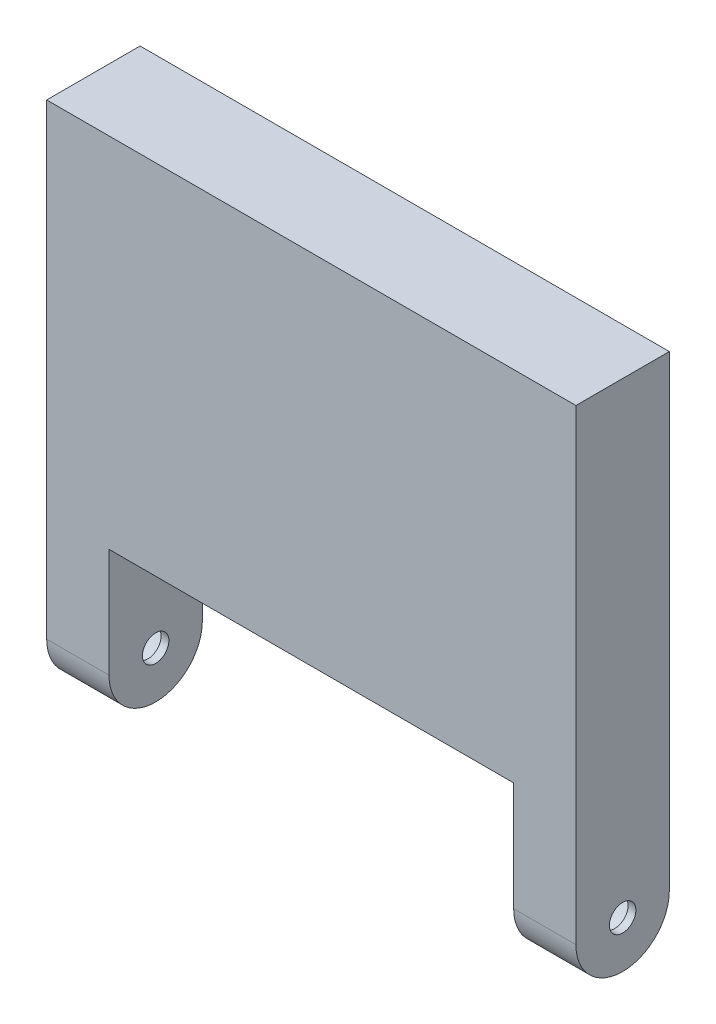
ISO-10303-21;
HEADER;
FILE_DESCRIPTION(('STEP AP214'),'2;1');
FILE_NAME('part.step','',(''),(''),'','','');
FILE_SCHEMA(('AUTOMOTIVE_DESIGN { 1 0 10303 214 1 1 1 1 }'));
ENDSEC;
DATA;
#1=APPLICATION_CONTEXT('core data for automotive mechanical design processes');
#2=APPLICATION_PROTOCOL_DEFINITION('international standard','automotive_design',2000,#1);
#3=PRODUCT_CONTEXT('',#1,'mechanical');
#4=PRODUCT('Part','Part','',(#3));
#5=PRODUCT_RELATED_PRODUCT_CATEGORY('part','',(#4));
#6=PRODUCT_DEFINITION_FORMATION('','',#4);
#7=PRODUCT_DEFINITION_CONTEXT('part definition',#1,'design');
#8=PRODUCT_DEFINITION('design','',#6,#7);
#9=PRODUCT_DEFINITION_SHAPE('','',#8);
#10=(LENGTH_UNIT() NAMED_UNIT(*) SI_UNIT(.MILLI.,.METRE.));
#11=(NAMED_UNIT(*) PLANE_ANGLE_UNIT() SI_UNIT($,.RADIAN.));
#12=(NAMED_UNIT(*) SI_UNIT($,.STERADIAN.) SOLID_ANGLE_UNIT());
#13=UNCERTAINTY_MEASURE_WITH_UNIT(LENGTH_MEASURE(1.E-05),#10,'distance_accuracy_value','');
#14=(GEOMETRIC_REPRESENTATION_CONTEXT(3) GLOBAL_UNCERTAINTY_ASSIGNED_CONTEXT((#13)) GLOBAL_UNIT_ASSIGNED_CONTEXT((#10,
#11,#12)) REPRESENTATION_CONTEXT('',''));
#15=CARTESIAN_POINT('',(0.,0.,0.));
#16=DIRECTION('',(0.,0.,1.));
#17=DIRECTION('',(1.,0.,0.));
#18=AXIS2_PLACEMENT_3D('',#15,#16,#17);
#19=CARTESIAN_POINT('',(-130.,0.,0.));
#20=DIRECTION('',(1.,0.,0.));
#21=DIRECTION('',(0.,0.,-1.));
#22=AXIS2_PLACEMENT_3D('',#19,#20,#21);
#23=PLANE('',#22);
#24=CARTESIAN_POINT('',(-130.,0.,0.));
#25=DIRECTION('',(1.,0.,0.));
#26=DIRECTION('',(0.,0.,-1.));
#27=AXIS2_PLACEMENT_3D('',#24,#25,#26);
#28=CIRCLE('',#27,8.5);
#29=CARTESIAN_POINT('',(-130.,0.,-8.5));
#30=VERTEX_POINT('',#29);
#31=EDGE_CURVE('E231',#30,#30,#28,.T.);
#32=ORIENTED_EDGE('',*,*,#31,.F.);
#33=EDGE_LOOP('',(#32));
#34=FACE_BOUND('',#33,.T.);
#35=DIRECTION('',(0.,-1.,0.));
#36=VECTOR('',#35,1.);
#37=CARTESIAN_POINT('',(-130.,0.,-30.));
#38=LINE('',#37,#36);
#39=CARTESIAN_POINT('',(-130.,70.,-30.));
#40=VERTEX_POINT('',#39);
#41=CARTESIAN_POINT('',(-130.,0.,-30.));
#42=VERTEX_POINT('',#41);
#43=EDGE_CURVE('E240',#40,#42,#38,.T.);
#44=ORIENTED_EDGE('',*,*,#43,.F.);
#45=DIRECTION('',(0.,0.,1.));
#46=VECTOR('',#45,1.);
#47=CARTESIAN_POINT('',(-130.,70.,0.));
#48=LINE('',#47,#46);
#49=CARTESIAN_POINT('',(-130.,70.,30.));
#50=VERTEX_POINT('',#49);
#51=EDGE_CURVE('E153',#40,#50,#48,.T.);
#52=ORIENTED_EDGE('',*,*,#51,.T.);
#53=DIRECTION('',(0.,1.,0.));
#54=VECTOR('',#53,1.);
#55=CARTESIAN_POINT('',(-130.,0.,30.));
#56=LINE('',#55,#54);
#57=CARTESIAN_POINT('',(-130.,0.,30.));
#58=VERTEX_POINT('',#57);
#59=EDGE_CURVE('E242',#58,#50,#56,.T.);
#60=ORIENTED_EDGE('',*,*,#59,.F.);
#61=CARTESIAN_POINT('',(-130.,0.,0.));
#62=DIRECTION('',(1.,0.,0.));
#63=DIRECTION('',(0.,0.,-1.));
#64=AXIS2_PLACEMENT_3D('',#61,#62,#63);
#65=CIRCLE('',#64,30.);
#66=EDGE_CURVE('E237',#58,#42,#65,.T.);
#67=ORIENTED_EDGE('',*,*,#66,.T.);
#68=EDGE_LOOP('',(#44,#52,#60,#67));
#69=FACE_BOUND('',#68,.T.);
#70=ADVANCED_FACE('F35',(#34,#69),#23,.T.);
#71=CARTESIAN_POINT('',(-165.,0.,0.));
#72=DIRECTION('',(-1.,0.,0.));
#73=DIRECTION('',(0.,0.,1.));
#74=AXIS2_PLACEMENT_3D('',#71,#72,#73);
#75=CYLINDRICAL_SURFACE('',#74,30.);
#76=CARTESIAN_POINT('',(-170.,0.,0.));
#77=DIRECTION('',(1.,0.,0.));
#78=DIRECTION('',(0.,0.,-1.));
#79=AXIS2_PLACEMENT_3D('',#76,#77,#78);
#80=CIRCLE('',#79,30.);
#81=CARTESIAN_POINT('',(-170.,0.,30.));
#82=VERTEX_POINT('',#81);
#83=CARTESIAN_POINT('',(-170.,0.,-30.));
#84=VERTEX_POINT('',#83);
#85=EDGE_CURVE('E279',#82,#84,#80,.T.);
#86=ORIENTED_EDGE('',*,*,#85,.T.);
#87=DIRECTION('',(-1.,0.,0.));
#88=VECTOR('',#87,1.);
#89=CARTESIAN_POINT('',(-165.,0.,-30.));
#90=LINE('',#89,#88);
#91=EDGE_CURVE('E11',#42,#84,#90,.T.);
#92=ORIENTED_EDGE('',*,*,#91,.F.);
#93=ORIENTED_EDGE('',*,*,#66,.F.);
#94=DIRECTION('',(-1.,0.,0.));
#95=VECTOR('',#94,1.);
#96=CARTESIAN_POINT('',(-165.,0.,30.));
#97=LINE('',#96,#95);
#98=EDGE_CURVE('E291',#58,#82,#97,.T.);
#99=ORIENTED_EDGE('',*,*,#98,.T.);
#100=EDGE_LOOP('',(#86,#92,#93,#99));
#101=FACE_BOUND('',#100,.T.);
#102=ADVANCED_FACE('F37',(#101),#75,.T.);
#103=CARTESIAN_POINT('',(-165.,0.,-30.));
#104=DIRECTION('',(0.,0.,-1.));
#105=DIRECTION('',(-1.,0.,0.));
#106=AXIS2_PLACEMENT_3D('',#103,#104,#105);
#107=PLANE('',#106);
#108=DIRECTION('',(0.,-1.,0.));
#109=VECTOR('',#108,1.);
#110=CARTESIAN_POINT('',(-170.,0.,-30.));
#111=LINE('',#110,#109);
#112=CARTESIAN_POINT('',(-170.,300.,-30.));
#113=VERTEX_POINT('',#112);
#114=EDGE_CURVE('E282',#113,#84,#111,.T.);
#115=ORIENTED_EDGE('',*,*,#114,.F.);
#116=DIRECTION('',(-1.,0.,0.));
#117=VECTOR('',#116,1.);
#118=CARTESIAN_POINT('',(-165.,300.,-30.));
#119=LINE('',#118,#117);
#120=CARTESIAN_POINT('',(170.,300.,-30.));
#121=VERTEX_POINT('',#120);
#122=EDGE_CURVE('E44',#121,#113,#119,.T.);
#123=ORIENTED_EDGE('',*,*,#122,.F.);
#124=DIRECTION('',(0.,-1.,0.));
#125=VECTOR('',#124,1.);
#126=CARTESIAN_POINT('',(170.,0.,-30.));
#127=LINE('',#126,#125);
#128=CARTESIAN_POINT('',(170.,0.,-30.));
#129=VERTEX_POINT('',#128);
#130=EDGE_CURVE('E208',#121,#129,#127,.T.);
#131=ORIENTED_EDGE('',*,*,#130,.T.);
#132=DIRECTION('',(1.,0.,0.));
#133=VECTOR('',#132,1.);
#134=CARTESIAN_POINT('',(165.,0.,-30.));
#135=LINE('',#134,#133);
#136=CARTESIAN_POINT('',(130.,0.,-30.));
#137=VERTEX_POINT('',#136);
#138=EDGE_CURVE('E171',#137,#129,#135,.T.);
#139=ORIENTED_EDGE('',*,*,#138,.F.);
#140=DIRECTION('',(0.,-1.,0.));
#141=VECTOR('',#140,1.);
#142=CARTESIAN_POINT('',(130.,0.,-30.));
#143=LINE('',#142,#141);
#144=CARTESIAN_POINT('',(130.,70.,-30.));
#145=VERTEX_POINT('',#144);
#146=EDGE_CURVE('E162',#145,#137,#143,.T.);
#147=ORIENTED_EDGE('',*,*,#146,.F.);
#148=DIRECTION('',(-1.,0.,0.));
#149=VECTOR('',#148,1.);
#150=CARTESIAN_POINT('',(237.697286480094,70.,-30.));
#151=LINE('',#150,#149);
#152=EDGE_CURVE('E148',#145,#40,#151,.T.);
#153=ORIENTED_EDGE('',*,*,#152,.T.);
#154=ORIENTED_EDGE('',*,*,#43,.T.);
#155=ORIENTED_EDGE('',*,*,#91,.T.);
#156=EDGE_LOOP('',(#115,#123,#131,#139,#147,#153,#154,#155));
#157=FACE_BOUND('',#156,.T.);
#158=ADVANCED_FACE('F169',(#157),#107,.T.);
#159=CARTESIAN_POINT('',(-165.,300.,0.));
#160=DIRECTION('',(0.,1.,0.));
#161=DIRECTION('',(0.,0.,1.));
#162=AXIS2_PLACEMENT_3D('',#159,#160,#161);
#163=PLANE('',#162);
#164=DIRECTION('',(0.,0.,-1.));
#165=VECTOR('',#164,1.);
#166=CARTESIAN_POINT('',(-170.,300.,0.));
#167=LINE('',#166,#165);
#168=CARTESIAN_POINT('',(-170.,300.,30.));
#169=VERTEX_POINT('',#168);
#170=EDGE_CURVE('E285',#169,#113,#167,.T.);
#171=ORIENTED_EDGE('',*,*,#170,.F.);
#172=DIRECTION('',(-1.,0.,0.));
#173=VECTOR('',#172,1.);
#174=CARTESIAN_POINT('',(-165.,300.,30.));
#175=LINE('',#174,#173);
#176=CARTESIAN_POINT('',(170.,300.,30.));
#177=VERTEX_POINT('',#176);
#178=EDGE_CURVE('E293',#177,#169,#175,.T.);
#179=ORIENTED_EDGE('',*,*,#178,.F.);
#180=DIRECTION('',(0.,0.,-1.));
#181=VECTOR('',#180,1.);
#182=CARTESIAN_POINT('',(170.,300.,0.));
#183=LINE('',#182,#181);
#184=EDGE_CURVE('E210',#177,#121,#183,.T.);
#185=ORIENTED_EDGE('',*,*,#184,.T.);
#186=ORIENTED_EDGE('',*,*,#122,.T.);
#187=EDGE_LOOP('',(#171,#179,#185,#186));
#188=FACE_BOUND('',#187,.T.);
#189=ADVANCED_FACE('F297',(#188),#163,.T.);
#190=CARTESIAN_POINT('',(-165.,0.,30.));
#191=DIRECTION('',(0.,0.,1.));
#192=DIRECTION('',(1.,0.,0.));
#193=AXIS2_PLACEMENT_3D('',#190,#191,#192);
#194=PLANE('',#193);
#195=DIRECTION('',(0.,1.,0.));
#196=VECTOR('',#195,1.);
#197=CARTESIAN_POINT('',(-170.,0.,30.));
#198=LINE('',#197,#196);
#199=EDGE_CURVE('E288',#82,#169,#198,.T.);
#200=ORIENTED_EDGE('',*,*,#199,.F.);
#201=ORIENTED_EDGE('',*,*,#98,.F.);
#202=ORIENTED_EDGE('',*,*,#59,.T.);
#203=DIRECTION('',(-1.,0.,0.));
#204=VECTOR('',#203,1.);
#205=CARTESIAN_POINT('',(237.697286480094,70.,30.));
#206=LINE('',#205,#204);
#207=CARTESIAN_POINT('',(130.,70.,30.));
#208=VERTEX_POINT('',#207);
#209=EDGE_CURVE('E51',#208,#50,#206,.T.);
#210=ORIENTED_EDGE('',*,*,#209,.F.);
#211=DIRECTION('',(0.,1.,0.));
#212=VECTOR('',#211,1.);
#213=CARTESIAN_POINT('',(130.,0.,30.));
#214=LINE('',#213,#212);
#215=CARTESIAN_POINT('',(130.,0.,30.));
#216=VERTEX_POINT('',#215);
#217=EDGE_CURVE('E164',#216,#208,#214,.T.);
#218=ORIENTED_EDGE('',*,*,#217,.F.);
#219=DIRECTION('',(1.,0.,0.));
#220=VECTOR('',#219,1.);
#221=CARTESIAN_POINT('',(165.,0.,30.));
#222=LINE('',#221,#220);
#223=CARTESIAN_POINT('',(170.,0.,30.));
#224=VERTEX_POINT('',#223);
#225=EDGE_CURVE('E216',#216,#224,#222,.T.);
#226=ORIENTED_EDGE('',*,*,#225,.T.);
#227=DIRECTION('',(0.,1.,0.));
#228=VECTOR('',#227,1.);
#229=CARTESIAN_POINT('',(170.,0.,30.));
#230=LINE('',#229,#228);
#231=EDGE_CURVE('E213',#224,#177,#230,.T.);
#232=ORIENTED_EDGE('',*,*,#231,.T.);
#233=ORIENTED_EDGE('',*,*,#178,.T.);
#234=EDGE_LOOP('',(#200,#201,#202,#210,#218,#226,#232,#233));
#235=FACE_BOUND('',#234,.T.);
#236=ADVANCED_FACE('F306',(#235),#194,.T.);
#237=CARTESIAN_POINT('',(-170.,0.,0.));
#238=DIRECTION('',(1.,0.,0.));
#239=DIRECTION('',(0.,0.,-1.));
#240=AXIS2_PLACEMENT_3D('',#237,#238,#239);
#241=PLANE('',#240);
#242=CARTESIAN_POINT('',(-170.,0.,0.));
#243=DIRECTION('',(1.,0.,0.));
#244=DIRECTION('',(0.,0.,-1.));
#245=AXIS2_PLACEMENT_3D('',#242,#243,#244);
#246=CIRCLE('',#245,8.5);
#247=CARTESIAN_POINT('',(-170.,0.,-8.5));
#248=VERTEX_POINT('',#247);
#249=EDGE_CURVE('E220',#248,#248,#246,.T.);
#250=ORIENTED_EDGE('',*,*,#249,.T.);
#251=EDGE_LOOP('',(#250));
#252=FACE_BOUND('',#251,.T.);
#253=ORIENTED_EDGE('',*,*,#85,.F.);
#254=ORIENTED_EDGE('',*,*,#199,.T.);
#255=ORIENTED_EDGE('',*,*,#170,.T.);
#256=ORIENTED_EDGE('',*,*,#114,.T.);
#257=EDGE_LOOP('',(#253,#254,#255,#256));
#258=FACE_BOUND('',#257,.T.);
#259=ADVANCED_FACE('F303',(#252,#258),#241,.F.);
#260=CARTESIAN_POINT('',(237.697286480094,70.,0.));
#261=DIRECTION('',(0.,-1.,0.));
#262=DIRECTION('',(0.,0.,-1.));
#263=AXIS2_PLACEMENT_3D('',#260,#261,#262);
#264=PLANE('',#263);
#265=ORIENTED_EDGE('',*,*,#152,.F.);
#266=DIRECTION('',(0.,0.,1.));
#267=VECTOR('',#266,1.);
#268=CARTESIAN_POINT('',(130.,70.,0.));
#269=LINE('',#268,#267);
#270=EDGE_CURVE('E151',#145,#208,#269,.T.);
#271=ORIENTED_EDGE('',*,*,#270,.T.);
#272=ORIENTED_EDGE('',*,*,#209,.T.);
#273=ORIENTED_EDGE('',*,*,#51,.F.);
#274=EDGE_LOOP('',(#265,#271,#272,#273));
#275=FACE_BOUND('',#274,.T.);
#276=ADVANCED_FACE('F150',(#275),#264,.T.);
#277=CARTESIAN_POINT('',(-135.,0.,0.));
#278=DIRECTION('',(-1.,0.,0.));
#279=DIRECTION('',(0.,0.,1.));
#280=AXIS2_PLACEMENT_3D('',#277,#278,#279);
#281=CYLINDRICAL_SURFACE('',#280,25.);
#282=CARTESIAN_POINT('',(-165.,0.,0.));
#283=DIRECTION('',(1.,0.,0.));
#284=DIRECTION('',(0.,0.,-1.));
#285=AXIS2_PLACEMENT_3D('',#282,#283,#284);
#286=CIRCLE('',#285,25.);
#287=CARTESIAN_POINT('',(-165.,0.,25.));
#288=VERTEX_POINT('',#287);
#289=CARTESIAN_POINT('',(-165.,0.,-25.));
#290=VERTEX_POINT('',#289);
#291=EDGE_CURVE('E264',#288,#290,#286,.T.);
#292=ORIENTED_EDGE('',*,*,#291,.F.);
#293=DIRECTION('',(-1.,0.,0.));
#294=VECTOR('',#293,1.);
#295=CARTESIAN_POINT('',(-135.,0.,25.));
#296=LINE('',#295,#294);
#297=CARTESIAN_POINT('',(-135.,0.,25.));
#298=VERTEX_POINT('',#297);
#299=EDGE_CURVE('E275',#298,#288,#296,.T.);
#300=ORIENTED_EDGE('',*,*,#299,.F.);
#301=CARTESIAN_POINT('',(-135.,0.,0.));
#302=DIRECTION('',(1.,0.,0.));
#303=DIRECTION('',(0.,0.,-1.));
#304=AXIS2_PLACEMENT_3D('',#301,#302,#303);
#305=CIRCLE('',#304,25.);
#306=CARTESIAN_POINT('',(-135.,0.,-25.));
#307=VERTEX_POINT('',#306);
#308=EDGE_CURVE('E256',#298,#307,#305,.T.);
#309=ORIENTED_EDGE('',*,*,#308,.T.);
#310=DIRECTION('',(-1.,0.,0.));
#311=VECTOR('',#310,1.);
#312=CARTESIAN_POINT('',(-135.,0.,-25.));
#313=LINE('',#312,#311);
#314=EDGE_CURVE('E277',#307,#290,#313,.T.);
#315=ORIENTED_EDGE('',*,*,#314,.T.);
#316=EDGE_LOOP('',(#292,#300,#309,#315));
#317=FACE_BOUND('',#316,.T.);
#318=ADVANCED_FACE('F333',(#317),#281,.F.);
#319=CARTESIAN_POINT('',(-135.,0.,0.));
#320=DIRECTION('',(1.,0.,0.));
#321=DIRECTION('',(0.,0.,-1.));
#322=AXIS2_PLACEMENT_3D('',#319,#320,#321);
#323=PLANE('',#322);
#324=CARTESIAN_POINT('',(-135.,0.,0.));
#325=DIRECTION('',(1.,0.,0.));
#326=DIRECTION('',(0.,0.,-1.));
#327=AXIS2_PLACEMENT_3D('',#324,#325,#326);
#328=CIRCLE('',#327,8.5);
#329=CARTESIAN_POINT('',(-135.,0.,-8.5));
#330=VERTEX_POINT('',#329);
#331=EDGE_CURVE('E228',#330,#330,#328,.T.);
#332=ORIENTED_EDGE('',*,*,#331,.T.);
#333=EDGE_LOOP('',(#332));
#334=FACE_BOUND('',#333,.T.);
#335=DIRECTION('',(0.,0.,1.));
#336=VECTOR('',#335,1.);
#337=CARTESIAN_POINT('',(-135.,75.,0.));
#338=LINE('',#337,#336);
#339=CARTESIAN_POINT('',(-135.,75.,-25.));
#340=VERTEX_POINT('',#339);
#341=CARTESIAN_POINT('',(-135.,75.,25.));
#342=VERTEX_POINT('',#341);
#343=EDGE_CURVE('E234',#340,#342,#338,.T.);
#344=ORIENTED_EDGE('',*,*,#343,.F.);
#345=DIRECTION('',(0.,-1.,0.));
#346=VECTOR('',#345,1.);
#347=CARTESIAN_POINT('',(-135.,0.,-25.));
#348=LINE('',#347,#346);
#349=EDGE_CURVE('E253',#340,#307,#348,.T.);
#350=ORIENTED_EDGE('',*,*,#349,.T.);
#351=ORIENTED_EDGE('',*,*,#308,.F.);
#352=DIRECTION('',(0.,1.,0.));
#353=VECTOR('',#352,1.);
#354=CARTESIAN_POINT('',(-135.,0.,25.));
#355=LINE('',#354,#353);
#356=EDGE_CURVE('E59',#298,#342,#355,.T.);
#357=ORIENTED_EDGE('',*,*,#356,.T.);
#358=EDGE_LOOP('',(#344,#350,#351,#357));
#359=FACE_BOUND('',#358,.T.);
#360=ADVANCED_FACE('F329',(#334,#359),#323,.F.);
#361=CARTESIAN_POINT('',(-165.,0.,0.));
#362=DIRECTION('',(1.,0.,0.));
#363=DIRECTION('',(0.,0.,-1.));
#364=AXIS2_PLACEMENT_3D('',#361,#362,#363);
#365=PLANE('',#364);
#366=CARTESIAN_POINT('',(-165.,0.,0.));
#367=DIRECTION('',(1.,0.,0.));
#368=DIRECTION('',(0.,0.,-1.));
#369=AXIS2_PLACEMENT_3D('',#366,#367,#368);
#370=CIRCLE('',#369,8.5);
#371=CARTESIAN_POINT('',(-165.,0.,-8.5));
#372=VERTEX_POINT('',#371);
#373=EDGE_CURVE('E39',#372,#372,#370,.T.);
#374=ORIENTED_EDGE('',*,*,#373,.F.);
#375=EDGE_LOOP('',(#374));
#376=FACE_BOUND('',#375,.T.);
#377=ORIENTED_EDGE('',*,*,#291,.T.);
#378=DIRECTION('',(0.,-1.,0.));
#379=VECTOR('',#378,1.);
#380=CARTESIAN_POINT('',(-165.,0.,-25.));
#381=LINE('',#380,#379);
#382=CARTESIAN_POINT('',(-165.,295.,-25.));
#383=VERTEX_POINT('',#382);
#384=EDGE_CURVE('E252',#383,#290,#381,.T.);
#385=ORIENTED_EDGE('',*,*,#384,.F.);
#386=DIRECTION('',(0.,0.,-1.));
#387=VECTOR('',#386,1.);
#388=CARTESIAN_POINT('',(-165.,295.,0.));
#389=LINE('',#388,#387);
#390=CARTESIAN_POINT('',(-165.,295.,25.));
#391=VERTEX_POINT('',#390);
#392=EDGE_CURVE('E257',#391,#383,#389,.T.);
#393=ORIENTED_EDGE('',*,*,#392,.F.);
#394=DIRECTION('',(0.,1.,0.));
#395=VECTOR('',#394,1.);
#396=CARTESIAN_POINT('',(-165.,0.,25.));
#397=LINE('',#396,#395);
#398=EDGE_CURVE('E267',#288,#391,#397,.T.);
#399=ORIENTED_EDGE('',*,*,#398,.F.);
#400=EDGE_LOOP('',(#377,#385,#393,#399));
#401=FACE_BOUND('',#400,.T.);
#402=ADVANCED_FACE('F332',(#376,#401),#365,.T.);
#403=CARTESIAN_POINT('',(-135.,295.,0.));
#404=DIRECTION('',(0.,1.,0.));
#405=DIRECTION('',(0.,0.,1.));
#406=AXIS2_PLACEMENT_3D('',#403,#404,#405);
#407=PLANE('',#406);
#408=ORIENTED_EDGE('',*,*,#392,.T.);
#409=DIRECTION('',(-1.,0.,0.));
#410=VECTOR('',#409,1.);
#411=CARTESIAN_POINT('',(-135.,295.,-25.));
#412=LINE('',#411,#410);
#413=CARTESIAN_POINT('',(165.,295.,-25.));
#414=VERTEX_POINT('',#413);
#415=EDGE_CURVE('E261',#414,#383,#412,.T.);
#416=ORIENTED_EDGE('',*,*,#415,.F.);
#417=DIRECTION('',(0.,0.,-1.));
#418=VECTOR('',#417,1.);
#419=CARTESIAN_POINT('',(165.,295.,0.));
#420=LINE('',#419,#418);
#421=CARTESIAN_POINT('',(165.,295.,25.));
#422=VERTEX_POINT('',#421);
#423=EDGE_CURVE('E184',#422,#414,#420,.T.);
#424=ORIENTED_EDGE('',*,*,#423,.F.);
#425=DIRECTION('',(-1.,0.,0.));
#426=VECTOR('',#425,1.);
#427=CARTESIAN_POINT('',(-135.,295.,25.));
#428=LINE('',#427,#426);
#429=EDGE_CURVE('E273',#422,#391,#428,.T.);
#430=ORIENTED_EDGE('',*,*,#429,.T.);
#431=EDGE_LOOP('',(#408,#416,#424,#430));
#432=FACE_BOUND('',#431,.T.);
#433=ADVANCED_FACE('F341',(#432),#407,.F.);
#434=CARTESIAN_POINT('',(-135.,0.,25.));
#435=DIRECTION('',(0.,0.,1.));
#436=DIRECTION('',(1.,0.,0.));
#437=AXIS2_PLACEMENT_3D('',#434,#435,#436);
#438=PLANE('',#437);
#439=ORIENTED_EDGE('',*,*,#398,.T.);
#440=ORIENTED_EDGE('',*,*,#429,.F.);
#441=DIRECTION('',(0.,1.,0.));
#442=VECTOR('',#441,1.);
#443=CARTESIAN_POINT('',(165.,0.,25.));
#444=LINE('',#443,#442);
#445=CARTESIAN_POINT('',(165.,0.,25.));
#446=VERTEX_POINT('',#445);
#447=EDGE_CURVE('E195',#446,#422,#444,.T.);
#448=ORIENTED_EDGE('',*,*,#447,.F.);
#449=DIRECTION('',(1.,0.,0.));
#450=VECTOR('',#449,1.);
#451=CARTESIAN_POINT('',(135.,0.,25.));
#452=LINE('',#451,#450);
#453=CARTESIAN_POINT('',(135.,0.,25.));
#454=VERTEX_POINT('',#453);
#455=EDGE_CURVE('E190',#454,#446,#452,.T.);
#456=ORIENTED_EDGE('',*,*,#455,.F.);
#457=DIRECTION('',(0.,1.,0.));
#458=VECTOR('',#457,1.);
#459=CARTESIAN_POINT('',(135.,0.,25.));
#460=LINE('',#459,#458);
#461=CARTESIAN_POINT('',(135.,75.,25.));
#462=VERTEX_POINT('',#461);
#463=EDGE_CURVE('E187',#454,#462,#460,.T.);
#464=ORIENTED_EDGE('',*,*,#463,.T.);
#465=DIRECTION('',(-1.,0.,0.));
#466=VECTOR('',#465,1.);
#467=CARTESIAN_POINT('',(-130.,75.,25.));
#468=LINE('',#467,#466);
#469=EDGE_CURVE('E245',#462,#342,#468,.T.);
#470=ORIENTED_EDGE('',*,*,#469,.T.);
#471=ORIENTED_EDGE('',*,*,#356,.F.);
#472=ORIENTED_EDGE('',*,*,#299,.T.);
#473=EDGE_LOOP('',(#439,#440,#448,#456,#464,#470,#471,#472));
#474=FACE_BOUND('',#473,.T.);
#475=ADVANCED_FACE('F339',(#474),#438,.F.);
#476=CARTESIAN_POINT('',(-130.,75.,0.));
#477=DIRECTION('',(0.,-1.,0.));
#478=DIRECTION('',(0.,0.,-1.));
#479=AXIS2_PLACEMENT_3D('',#476,#477,#478);
#480=PLANE('',#479);
#481=ORIENTED_EDGE('',*,*,#343,.T.);
#482=ORIENTED_EDGE('',*,*,#469,.F.);
#483=DIRECTION('',(0.,0.,1.));
#484=VECTOR('',#483,1.);
#485=CARTESIAN_POINT('',(135.,75.,0.));
#486=LINE('',#485,#484);
#487=CARTESIAN_POINT('',(135.,75.,-25.));
#488=VERTEX_POINT('',#487);
#489=EDGE_CURVE('E165',#488,#462,#486,.T.);
#490=ORIENTED_EDGE('',*,*,#489,.F.);
#491=DIRECTION('',(-1.,0.,0.));
#492=VECTOR('',#491,1.);
#493=CARTESIAN_POINT('',(-130.,75.,-25.));
#494=LINE('',#493,#492);
#495=EDGE_CURVE('E249',#488,#340,#494,.T.);
#496=ORIENTED_EDGE('',*,*,#495,.T.);
#497=EDGE_LOOP('',(#481,#482,#490,#496));
#498=FACE_BOUND('',#497,.T.);
#499=ADVANCED_FACE('F335',(#498),#480,.F.);
#500=CARTESIAN_POINT('',(-135.,0.,-25.));
#501=DIRECTION('',(0.,0.,-1.));
#502=DIRECTION('',(0.,1.,0.));
#503=AXIS2_PLACEMENT_3D('',#500,#501,#502);
#504=PLANE('',#503);
#505=ORIENTED_EDGE('',*,*,#384,.T.);
#506=ORIENTED_EDGE('',*,*,#314,.F.);
#507=ORIENTED_EDGE('',*,*,#349,.F.);
#508=ORIENTED_EDGE('',*,*,#495,.F.);
#509=DIRECTION('',(0.,-1.,0.));
#510=VECTOR('',#509,1.);
#511=CARTESIAN_POINT('',(135.,0.,-25.));
#512=LINE('',#511,#510);
#513=CARTESIAN_POINT('',(135.,0.,-25.));
#514=VERTEX_POINT('',#513);
#515=EDGE_CURVE('E181',#488,#514,#512,.T.);
#516=ORIENTED_EDGE('',*,*,#515,.T.);
#517=DIRECTION('',(1.,0.,0.));
#518=VECTOR('',#517,1.);
#519=CARTESIAN_POINT('',(135.,0.,-25.));
#520=LINE('',#519,#518);
#521=CARTESIAN_POINT('',(165.,0.,-25.));
#522=VERTEX_POINT('',#521);
#523=EDGE_CURVE('E202',#514,#522,#520,.T.);
#524=ORIENTED_EDGE('',*,*,#523,.T.);
#525=DIRECTION('',(0.,-1.,0.));
#526=VECTOR('',#525,1.);
#527=CARTESIAN_POINT('',(165.,0.,-25.));
#528=LINE('',#527,#526);
#529=EDGE_CURVE('E175',#414,#522,#528,.T.);
#530=ORIENTED_EDGE('',*,*,#529,.F.);
#531=ORIENTED_EDGE('',*,*,#415,.T.);
#532=EDGE_LOOP('',(#505,#506,#507,#508,#516,#524,#530,#531));
#533=FACE_BOUND('',#532,.T.);
#534=ADVANCED_FACE('F338',(#533),#504,.F.);
#535=CARTESIAN_POINT('',(-170.,0.,0.));
#536=DIRECTION('',(1.,0.,0.));
#537=DIRECTION('',(0.,0.,-1.));
#538=AXIS2_PLACEMENT_3D('',#535,#536,#537);
#539=CYLINDRICAL_SURFACE('',#538,8.5);
#540=ORIENTED_EDGE('',*,*,#373,.T.);
#541=EDGE_LOOP('',(#540));
#542=FACE_BOUND('',#541,.T.);
#543=ORIENTED_EDGE('',*,*,#249,.F.);
#544=EDGE_LOOP('',(#543));
#545=FACE_BOUND('',#544,.T.);
#546=ADVANCED_FACE('F353',(#542,#545),#539,.F.);
#547=ORIENTED_EDGE('',*,*,#31,.T.);
#548=EDGE_LOOP('',(#547));
#549=FACE_BOUND('',#548,.T.);
#550=ORIENTED_EDGE('',*,*,#331,.F.);
#551=EDGE_LOOP('',(#550));
#552=FACE_BOUND('',#551,.T.);
#553=ADVANCED_FACE('F425',(#549,#552),#539,.F.);
#554=CARTESIAN_POINT('',(130.,0.,0.));
#555=DIRECTION('',(-1.,0.,0.));
#556=DIRECTION('',(0.,0.,-1.));
#557=AXIS2_PLACEMENT_3D('',#554,#555,#556);
#558=PLANE('',#557);
#559=CARTESIAN_POINT('',(130.,0.,0.));
#560=DIRECTION('',(1.,0.,0.));
#561=DIRECTION('',(0.,0.,-1.));
#562=AXIS2_PLACEMENT_3D('',#559,#560,#561);
#563=CIRCLE('',#562,8.5);
#564=CARTESIAN_POINT('',(130.,0.,-8.5));
#565=VERTEX_POINT('',#564);
#566=EDGE_CURVE('E166',#565,#565,#563,.T.);
#567=ORIENTED_EDGE('',*,*,#566,.T.);
#568=EDGE_LOOP('',(#567));
#569=FACE_BOUND('',#568,.T.);
#570=ORIENTED_EDGE('',*,*,#146,.T.);
#571=CARTESIAN_POINT('',(130.,0.,0.));
#572=DIRECTION('',(1.,0.,0.));
#573=DIRECTION('',(0.,0.,-1.));
#574=AXIS2_PLACEMENT_3D('',#571,#572,#573);
#575=CIRCLE('',#574,30.);
#576=EDGE_CURVE('E173',#216,#137,#575,.T.);
#577=ORIENTED_EDGE('',*,*,#576,.F.);
#578=ORIENTED_EDGE('',*,*,#217,.T.);
#579=ORIENTED_EDGE('',*,*,#270,.F.);
#580=EDGE_LOOP('',(#570,#577,#578,#579));
#581=FACE_BOUND('',#580,.T.);
#582=ADVANCED_FACE('F160',(#569,#581),#558,.T.);
#583=CARTESIAN_POINT('',(165.,0.,0.));
#584=DIRECTION('',(1.,0.,0.));
#585=DIRECTION('',(0.,0.,1.));
#586=AXIS2_PLACEMENT_3D('',#583,#584,#585);
#587=CYLINDRICAL_SURFACE('',#586,30.);
#588=CARTESIAN_POINT('',(170.,0.,0.));
#589=DIRECTION('',(1.,0.,0.));
#590=DIRECTION('',(0.,0.,-1.));
#591=AXIS2_PLACEMENT_3D('',#588,#589,#590);
#592=CIRCLE('',#591,30.);
#593=EDGE_CURVE('E205',#224,#129,#592,.T.);
#594=ORIENTED_EDGE('',*,*,#593,.F.);
#595=ORIENTED_EDGE('',*,*,#225,.F.);
#596=ORIENTED_EDGE('',*,*,#576,.T.);
#597=ORIENTED_EDGE('',*,*,#138,.T.);
#598=EDGE_LOOP('',(#594,#595,#596,#597));
#599=FACE_BOUND('',#598,.T.);
#600=ADVANCED_FACE('F312',(#599),#587,.T.);
#601=CARTESIAN_POINT('',(170.,0.,0.));
#602=DIRECTION('',(-1.,0.,0.));
#603=DIRECTION('',(0.,0.,-1.));
#604=AXIS2_PLACEMENT_3D('',#601,#602,#603);
#605=PLANE('',#604);
#606=CARTESIAN_POINT('',(170.,0.,0.));
#607=DIRECTION('',(1.,0.,0.));
#608=DIRECTION('',(0.,0.,-1.));
#609=AXIS2_PLACEMENT_3D('',#606,#607,#608);
#610=CIRCLE('',#609,8.5);
#611=CARTESIAN_POINT('',(170.,0.,-8.5));
#612=VERTEX_POINT('',#611);
#613=EDGE_CURVE('E225',#612,#612,#610,.T.);
#614=ORIENTED_EDGE('',*,*,#613,.F.);
#615=EDGE_LOOP('',(#614));
#616=FACE_BOUND('',#615,.T.);
#617=ORIENTED_EDGE('',*,*,#593,.T.);
#618=ORIENTED_EDGE('',*,*,#130,.F.);
#619=ORIENTED_EDGE('',*,*,#184,.F.);
#620=ORIENTED_EDGE('',*,*,#231,.F.);
#621=EDGE_LOOP('',(#617,#618,#619,#620));
#622=FACE_BOUND('',#621,.T.);
#623=ADVANCED_FACE('F310',(#616,#622),#605,.F.);
#624=CARTESIAN_POINT('',(135.,0.,0.));
#625=DIRECTION('',(1.,0.,0.));
#626=DIRECTION('',(0.,0.,1.));
#627=AXIS2_PLACEMENT_3D('',#624,#625,#626);
#628=CYLINDRICAL_SURFACE('',#627,25.);
#629=CARTESIAN_POINT('',(165.,0.,0.));
#630=DIRECTION('',(1.,0.,0.));
#631=DIRECTION('',(0.,0.,-1.));
#632=AXIS2_PLACEMENT_3D('',#629,#630,#631);
#633=CIRCLE('',#632,25.);
#634=EDGE_CURVE('E192',#446,#522,#633,.T.);
#635=ORIENTED_EDGE('',*,*,#634,.T.);
#636=ORIENTED_EDGE('',*,*,#523,.F.);
#637=CARTESIAN_POINT('',(135.,0.,0.));
#638=DIRECTION('',(1.,0.,0.));
#639=DIRECTION('',(0.,0.,-1.));
#640=AXIS2_PLACEMENT_3D('',#637,#638,#639);
#641=CIRCLE('',#640,25.);
#642=EDGE_CURVE('E183',#454,#514,#641,.T.);
#643=ORIENTED_EDGE('',*,*,#642,.F.);
#644=ORIENTED_EDGE('',*,*,#455,.T.);
#645=EDGE_LOOP('',(#635,#636,#643,#644));
#646=FACE_BOUND('',#645,.T.);
#647=ADVANCED_FACE('F454',(#646),#628,.F.);
#648=CARTESIAN_POINT('',(135.,0.,0.));
#649=DIRECTION('',(-1.,0.,0.));
#650=DIRECTION('',(0.,0.,-1.));
#651=AXIS2_PLACEMENT_3D('',#648,#649,#650);
#652=PLANE('',#651);
#653=CARTESIAN_POINT('',(135.,0.,0.));
#654=DIRECTION('',(1.,0.,0.));
#655=DIRECTION('',(0.,0.,-1.));
#656=AXIS2_PLACEMENT_3D('',#653,#654,#655);
#657=CIRCLE('',#656,8.5);
#658=CARTESIAN_POINT('',(135.,0.,-8.5));
#659=VERTEX_POINT('',#658);
#660=EDGE_CURVE('E224',#659,#659,#657,.T.);
#661=ORIENTED_EDGE('',*,*,#660,.F.);
#662=EDGE_LOOP('',(#661));
#663=FACE_BOUND('',#662,.T.);
#664=ORIENTED_EDGE('',*,*,#489,.T.);
#665=ORIENTED_EDGE('',*,*,#463,.F.);
#666=ORIENTED_EDGE('',*,*,#642,.T.);
#667=ORIENTED_EDGE('',*,*,#515,.F.);
#668=EDGE_LOOP('',(#664,#665,#666,#667));
#669=FACE_BOUND('',#668,.T.);
#670=ADVANCED_FACE('F462',(#663,#669),#652,.F.);
#671=CARTESIAN_POINT('',(165.,0.,0.));
#672=DIRECTION('',(-1.,0.,0.));
#673=DIRECTION('',(0.,0.,-1.));
#674=AXIS2_PLACEMENT_3D('',#671,#672,#673);
#675=PLANE('',#674);
#676=CARTESIAN_POINT('',(165.,0.,0.));
#677=DIRECTION('',(1.,0.,0.));
#678=DIRECTION('',(0.,0.,-1.));
#679=AXIS2_PLACEMENT_3D('',#676,#677,#678);
#680=CIRCLE('',#679,8.5);
#681=CARTESIAN_POINT('',(165.,0.,-8.5));
#682=VERTEX_POINT('',#681);
#683=EDGE_CURVE('E221',#682,#682,#680,.T.);
#684=ORIENTED_EDGE('',*,*,#683,.T.);
#685=EDGE_LOOP('',(#684));
#686=FACE_BOUND('',#685,.T.);
#687=ORIENTED_EDGE('',*,*,#634,.F.);
#688=ORIENTED_EDGE('',*,*,#447,.T.);
#689=ORIENTED_EDGE('',*,*,#423,.T.);
#690=ORIENTED_EDGE('',*,*,#529,.T.);
#691=EDGE_LOOP('',(#687,#688,#689,#690));
#692=FACE_BOUND('',#691,.T.);
#693=ADVANCED_FACE('F470',(#686,#692),#675,.T.);
#694=CARTESIAN_POINT('',(170.,0.,0.));
#695=DIRECTION('',(-1.,0.,0.));
#696=DIRECTION('',(0.,0.,-1.));
#697=AXIS2_PLACEMENT_3D('',#694,#695,#696);
#698=CYLINDRICAL_SURFACE('',#697,8.5);
#699=ORIENTED_EDGE('',*,*,#683,.F.);
#700=EDGE_LOOP('',(#699));
#701=FACE_BOUND('',#700,.T.);
#702=ORIENTED_EDGE('',*,*,#613,.T.);
#703=EDGE_LOOP('',(#702));
#704=FACE_BOUND('',#703,.T.);
#705=ADVANCED_FACE('F478',(#701,#704),#698,.F.);
#706=ORIENTED_EDGE('',*,*,#566,.F.);
#707=EDGE_LOOP('',(#706));
#708=FACE_BOUND('',#707,.T.);
#709=ORIENTED_EDGE('',*,*,#660,.T.);
#710=EDGE_LOOP('',(#709));
#711=FACE_BOUND('',#710,.T.);
#712=ADVANCED_FACE('F486',(#708,#711),#698,.F.);
#713=CLOSED_SHELL('',(#70,#102,#158,#189,#236,#259,#276,#318,#360,#402,#433,#475,#499,#534,#546,
#553,#582,#600,#623,#647,#670,#693,#705,#712));
#714=MANIFOLD_SOLID_BREP('B2',#713);
#715=ADVANCED_BREP_SHAPE_REPRESENTATION('',(#18,#714),#14);
#716=SHAPE_DEFINITION_REPRESENTATION(#9,#715);
ENDSEC;
END-ISO-10303-21;
